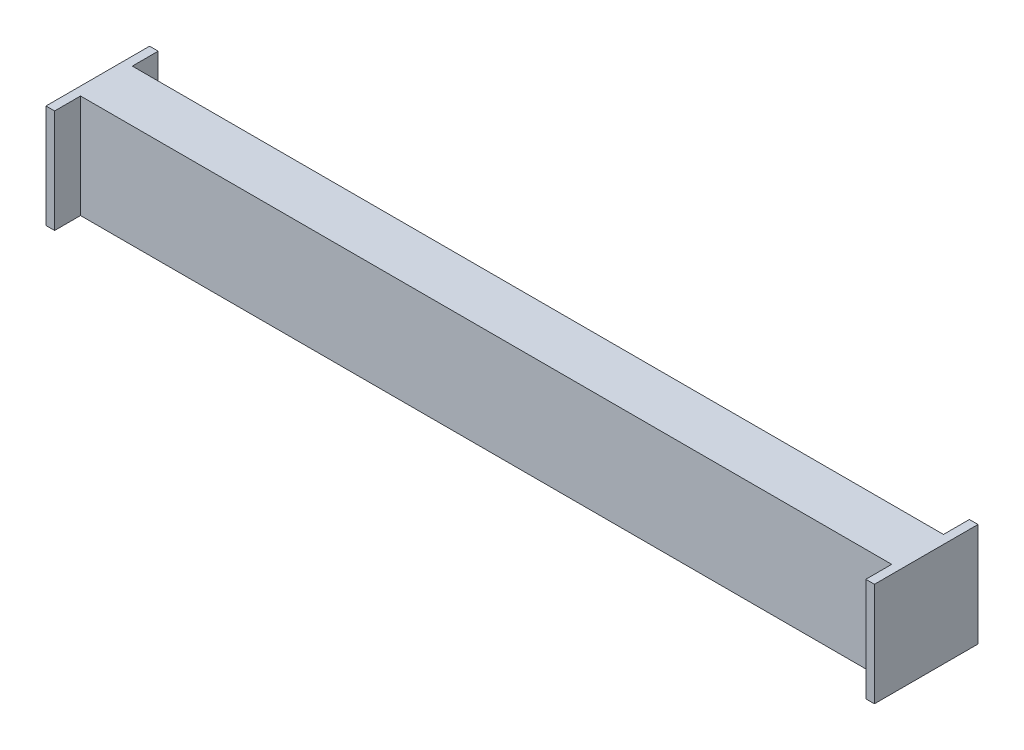
ISO-10303-21;
HEADER;
FILE_DESCRIPTION(('STEP AP214'),'2;1');
FILE_NAME('part.step','',(''),(''),'','','');
FILE_SCHEMA(('AUTOMOTIVE_DESIGN { 1 0 10303 214 1 1 1 1 }'));
ENDSEC;
DATA;
#1=APPLICATION_CONTEXT('core data for automotive mechanical design processes');
#2=APPLICATION_PROTOCOL_DEFINITION('international standard','automotive_design',2000,#1);
#3=PRODUCT_CONTEXT('',#1,'mechanical');
#4=PRODUCT('Part','Part','',(#3));
#5=PRODUCT_RELATED_PRODUCT_CATEGORY('part','',(#4));
#6=PRODUCT_DEFINITION_FORMATION('','',#4);
#7=PRODUCT_DEFINITION_CONTEXT('part definition',#1,'design');
#8=PRODUCT_DEFINITION('design','',#6,#7);
#9=PRODUCT_DEFINITION_SHAPE('','',#8);
#10=(LENGTH_UNIT() NAMED_UNIT(*) SI_UNIT(.MILLI.,.METRE.));
#11=(NAMED_UNIT(*) PLANE_ANGLE_UNIT() SI_UNIT($,.RADIAN.));
#12=(NAMED_UNIT(*) SI_UNIT($,.STERADIAN.) SOLID_ANGLE_UNIT());
#13=UNCERTAINTY_MEASURE_WITH_UNIT(LENGTH_MEASURE(1.E-05),#10,'distance_accuracy_value','');
#14=(GEOMETRIC_REPRESENTATION_CONTEXT(3) GLOBAL_UNCERTAINTY_ASSIGNED_CONTEXT((#13)) GLOBAL_UNIT_ASSIGNED_CONTEXT((#10,
#11,#12)) REPRESENTATION_CONTEXT('',''));
#15=CARTESIAN_POINT('',(0.,0.,0.));
#16=DIRECTION('',(0.,0.,1.));
#17=DIRECTION('',(1.,0.,0.));
#18=AXIS2_PLACEMENT_3D('',#15,#16,#17);
#19=CARTESIAN_POINT('',(1219.2,-76.2,-38.1));
#20=DIRECTION('',(0.,0.,1.));
#21=DIRECTION('',(1.,0.,0.));
#22=AXIS2_PLACEMENT_3D('',#19,#20,#21);
#23=PLANE('',#22);
#24=DIRECTION('',(-1.,0.,0.));
#25=VECTOR('',#24,1.);
#26=CARTESIAN_POINT('',(1219.2,-76.2,-38.1));
#27=LINE('',#26,#25);
#28=CARTESIAN_POINT('',(1206.5,-76.2,-38.1));
#29=VERTEX_POINT('',#28);
#30=CARTESIAN_POINT('',(12.7000000000004,-76.2,-38.1));
#31=VERTEX_POINT('',#30);
#32=EDGE_CURVE('E207',#29,#31,#27,.T.);
#33=ORIENTED_EDGE('',*,*,#32,.T.);
#34=DIRECTION('',(0.,1.,0.));
#35=VECTOR('',#34,1.);
#36=CARTESIAN_POINT('',(12.6999999999999,-76.2,-38.1));
#37=LINE('',#36,#35);
#38=CARTESIAN_POINT('',(12.7000000000004,76.2,-38.1));
#39=VERTEX_POINT('',#38);
#40=EDGE_CURVE('E46',#31,#39,#37,.T.);
#41=ORIENTED_EDGE('',*,*,#40,.T.);
#42=DIRECTION('',(-1.,0.,0.));
#43=VECTOR('',#42,1.);
#44=CARTESIAN_POINT('',(1219.2,76.2,-38.1));
#45=LINE('',#44,#43);
#46=CARTESIAN_POINT('',(1206.5,76.2,-38.1));
#47=VERTEX_POINT('',#46);
#48=EDGE_CURVE('E11',#47,#39,#45,.T.);
#49=ORIENTED_EDGE('',*,*,#48,.F.);
#50=DIRECTION('',(0.,-1.,0.));
#51=VECTOR('',#50,1.);
#52=CARTESIAN_POINT('',(1206.5,-76.2,-38.1));
#53=LINE('',#52,#51);
#54=EDGE_CURVE('E199',#47,#29,#53,.T.);
#55=ORIENTED_EDGE('',*,*,#54,.T.);
#56=EDGE_LOOP('',(#33,#41,#49,#55));
#57=FACE_BOUND('',#56,.T.);
#58=ADVANCED_FACE('F32',(#57),#23,.F.);
#59=CARTESIAN_POINT('',(1219.2,76.2,38.1));
#60=DIRECTION('',(0.,-1.,0.));
#61=DIRECTION('',(0.,0.,-1.));
#62=AXIS2_PLACEMENT_3D('',#59,#60,#61);
#63=PLANE('',#62);
#64=ORIENTED_EDGE('',*,*,#48,.T.);
#65=DIRECTION('',(0.,0.,-1.));
#66=VECTOR('',#65,1.);
#67=CARTESIAN_POINT('',(12.7,76.2,-76.2));
#68=LINE('',#67,#66);
#69=CARTESIAN_POINT('',(12.7,76.2,-76.2));
#70=VERTEX_POINT('',#69);
#71=EDGE_CURVE('E140',#39,#70,#68,.T.);
#72=ORIENTED_EDGE('',*,*,#71,.T.);
#73=DIRECTION('',(-1.,0.,0.));
#74=VECTOR('',#73,1.);
#75=CARTESIAN_POINT('',(12.7,76.2,-76.2));
#76=LINE('',#75,#74);
#77=CARTESIAN_POINT('',(0.,76.2,-76.2));
#78=VERTEX_POINT('',#77);
#79=EDGE_CURVE('E130',#70,#78,#76,.T.);
#80=ORIENTED_EDGE('',*,*,#79,.T.);
#81=DIRECTION('',(0.,0.,1.));
#82=VECTOR('',#81,1.);
#83=CARTESIAN_POINT('',(0.,76.2,38.1));
#84=LINE('',#83,#82);
#85=CARTESIAN_POINT('',(0.,76.2,76.2));
#86=VERTEX_POINT('',#85);
#87=EDGE_CURVE('E125',#78,#86,#84,.T.);
#88=ORIENTED_EDGE('',*,*,#87,.T.);
#89=DIRECTION('',(-1.,0.,0.));
#90=VECTOR('',#89,1.);
#91=CARTESIAN_POINT('',(12.7,76.2,76.2));
#92=LINE('',#91,#90);
#93=CARTESIAN_POINT('',(12.7,76.2,76.2));
#94=VERTEX_POINT('',#93);
#95=EDGE_CURVE('E120',#94,#86,#92,.T.);
#96=ORIENTED_EDGE('',*,*,#95,.F.);
#97=CARTESIAN_POINT('',(12.7000000000004,76.2,38.1));
#98=VERTEX_POINT('',#97);
#99=EDGE_CURVE('E123',#94,#98,#68,.T.);
#100=ORIENTED_EDGE('',*,*,#99,.T.);
#101=DIRECTION('',(-1.,0.,0.));
#102=VECTOR('',#101,1.);
#103=CARTESIAN_POINT('',(1219.2,76.2,38.1));
#104=LINE('',#103,#102);
#105=CARTESIAN_POINT('',(1206.5,76.2,38.1));
#106=VERTEX_POINT('',#105);
#107=EDGE_CURVE('E39',#106,#98,#104,.T.);
#108=ORIENTED_EDGE('',*,*,#107,.F.);
#109=DIRECTION('',(0.,0.,1.));
#110=VECTOR('',#109,1.);
#111=CARTESIAN_POINT('',(1206.5,76.2,76.2));
#112=LINE('',#111,#110);
#113=CARTESIAN_POINT('',(1206.5,76.2,76.2));
#114=VERTEX_POINT('',#113);
#115=EDGE_CURVE('E169',#106,#114,#112,.T.);
#116=ORIENTED_EDGE('',*,*,#115,.T.);
#117=DIRECTION('',(1.,0.,0.));
#118=VECTOR('',#117,1.);
#119=CARTESIAN_POINT('',(1206.5,76.2,76.2));
#120=LINE('',#119,#118);
#121=CARTESIAN_POINT('',(1219.2,76.2,76.2));
#122=VERTEX_POINT('',#121);
#123=EDGE_CURVE('E193',#114,#122,#120,.T.);
#124=ORIENTED_EDGE('',*,*,#123,.T.);
#125=DIRECTION('',(0.,0.,1.));
#126=VECTOR('',#125,1.);
#127=CARTESIAN_POINT('',(1219.2,76.2,38.1));
#128=LINE('',#127,#126);
#129=CARTESIAN_POINT('',(1219.2,76.2,-76.2));
#130=VERTEX_POINT('',#129);
#131=EDGE_CURVE('E202',#130,#122,#128,.T.);
#132=ORIENTED_EDGE('',*,*,#131,.F.);
#133=DIRECTION('',(1.,0.,0.));
#134=VECTOR('',#133,1.);
#135=CARTESIAN_POINT('',(1206.5,76.2,-76.2));
#136=LINE('',#135,#134);
#137=CARTESIAN_POINT('',(1206.5,76.2,-76.2));
#138=VERTEX_POINT('',#137);
#139=EDGE_CURVE('E181',#138,#130,#136,.T.);
#140=ORIENTED_EDGE('',*,*,#139,.F.);
#141=EDGE_CURVE('E171',#138,#47,#112,.T.);
#142=ORIENTED_EDGE('',*,*,#141,.T.);
#143=EDGE_LOOP('',(#64,#72,#80,#88,#96,#100,#108,#116,#124,#132,#140,#142));
#144=FACE_BOUND('',#143,.T.);
#145=ADVANCED_FACE('F122',(#144),#63,.F.);
#146=CARTESIAN_POINT('',(1219.2,-76.2,38.1));
#147=DIRECTION('',(0.,0.,-1.));
#148=DIRECTION('',(-1.,0.,0.));
#149=AXIS2_PLACEMENT_3D('',#146,#147,#148);
#150=PLANE('',#149);
#151=ORIENTED_EDGE('',*,*,#107,.T.);
#152=DIRECTION('',(0.,-1.,0.));
#153=VECTOR('',#152,1.);
#154=CARTESIAN_POINT('',(12.6999999999999,-76.2,38.1));
#155=LINE('',#154,#153);
#156=CARTESIAN_POINT('',(12.7000000000004,-76.2,38.1));
#157=VERTEX_POINT('',#156);
#158=EDGE_CURVE('E138',#98,#157,#155,.T.);
#159=ORIENTED_EDGE('',*,*,#158,.T.);
#160=DIRECTION('',(-1.,0.,0.));
#161=VECTOR('',#160,1.);
#162=CARTESIAN_POINT('',(1219.2,-76.2,38.1));
#163=LINE('',#162,#161);
#164=CARTESIAN_POINT('',(1206.5,-76.2,38.1));
#165=VERTEX_POINT('',#164);
#166=EDGE_CURVE('E211',#165,#157,#163,.T.);
#167=ORIENTED_EDGE('',*,*,#166,.F.);
#168=DIRECTION('',(0.,1.,0.));
#169=VECTOR('',#168,1.);
#170=CARTESIAN_POINT('',(1206.5,-76.2,38.1));
#171=LINE('',#170,#169);
#172=EDGE_CURVE('E189',#165,#106,#171,.T.);
#173=ORIENTED_EDGE('',*,*,#172,.T.);
#174=EDGE_LOOP('',(#151,#159,#167,#173));
#175=FACE_BOUND('',#174,.T.);
#176=ADVANCED_FACE('F217',(#175),#150,.F.);
#177=CARTESIAN_POINT('',(1219.2,-76.2,38.1));
#178=DIRECTION('',(0.,1.,0.));
#179=DIRECTION('',(0.,0.,1.));
#180=AXIS2_PLACEMENT_3D('',#177,#178,#179);
#181=PLANE('',#180);
#182=ORIENTED_EDGE('',*,*,#166,.T.);
#183=DIRECTION('',(0.,0.,1.));
#184=VECTOR('',#183,1.);
#185=CARTESIAN_POINT('',(12.7,-76.2,-76.2));
#186=LINE('',#185,#184);
#187=CARTESIAN_POINT('',(12.7,-76.2,76.2));
#188=VERTEX_POINT('',#187);
#189=EDGE_CURVE('E154',#157,#188,#186,.T.);
#190=ORIENTED_EDGE('',*,*,#189,.T.);
#191=DIRECTION('',(-1.,0.,0.));
#192=VECTOR('',#191,1.);
#193=CARTESIAN_POINT('',(12.7,-76.2,76.2));
#194=LINE('',#193,#192);
#195=CARTESIAN_POINT('',(0.,-76.2,76.2));
#196=VERTEX_POINT('',#195);
#197=EDGE_CURVE('E145',#188,#196,#194,.T.);
#198=ORIENTED_EDGE('',*,*,#197,.T.);
#199=DIRECTION('',(0.,0.,-1.));
#200=VECTOR('',#199,1.);
#201=CARTESIAN_POINT('',(0.,-76.2,38.1));
#202=LINE('',#201,#200);
#203=CARTESIAN_POINT('',(0.,-76.2,-76.2));
#204=VERTEX_POINT('',#203);
#205=EDGE_CURVE('E205',#196,#204,#202,.T.);
#206=ORIENTED_EDGE('',*,*,#205,.T.);
#207=DIRECTION('',(-1.,0.,0.));
#208=VECTOR('',#207,1.);
#209=CARTESIAN_POINT('',(12.7,-76.2,-76.2));
#210=LINE('',#209,#208);
#211=CARTESIAN_POINT('',(12.7,-76.2,-76.2));
#212=VERTEX_POINT('',#211);
#213=EDGE_CURVE('E159',#212,#204,#210,.T.);
#214=ORIENTED_EDGE('',*,*,#213,.F.);
#215=EDGE_CURVE('E131',#212,#31,#186,.T.);
#216=ORIENTED_EDGE('',*,*,#215,.T.);
#217=ORIENTED_EDGE('',*,*,#32,.F.);
#218=DIRECTION('',(0.,0.,-1.));
#219=VECTOR('',#218,1.);
#220=CARTESIAN_POINT('',(1206.5,-76.2,76.2));
#221=LINE('',#220,#219);
#222=CARTESIAN_POINT('',(1206.5,-76.2,-76.2));
#223=VERTEX_POINT('',#222);
#224=EDGE_CURVE('E177',#29,#223,#221,.T.);
#225=ORIENTED_EDGE('',*,*,#224,.T.);
#226=DIRECTION('',(1.,0.,0.));
#227=VECTOR('',#226,1.);
#228=CARTESIAN_POINT('',(1206.5,-76.2,-76.2));
#229=LINE('',#228,#227);
#230=CARTESIAN_POINT('',(1219.2,-76.2,-76.2));
#231=VERTEX_POINT('',#230);
#232=EDGE_CURVE('E186',#223,#231,#229,.T.);
#233=ORIENTED_EDGE('',*,*,#232,.T.);
#234=DIRECTION('',(0.,0.,-1.));
#235=VECTOR('',#234,1.);
#236=CARTESIAN_POINT('',(1219.2,-76.2,38.1));
#237=LINE('',#236,#235);
#238=CARTESIAN_POINT('',(1219.2,-76.2,76.2));
#239=VERTEX_POINT('',#238);
#240=EDGE_CURVE('E204',#239,#231,#237,.T.);
#241=ORIENTED_EDGE('',*,*,#240,.F.);
#242=DIRECTION('',(1.,0.,0.));
#243=VECTOR('',#242,1.);
#244=CARTESIAN_POINT('',(1206.5,-76.2,76.2));
#245=LINE('',#244,#243);
#246=CARTESIAN_POINT('',(1206.5,-76.2,76.2));
#247=VERTEX_POINT('',#246);
#248=EDGE_CURVE('E190',#247,#239,#245,.T.);
#249=ORIENTED_EDGE('',*,*,#248,.F.);
#250=EDGE_CURVE('E178',#247,#165,#221,.T.);
#251=ORIENTED_EDGE('',*,*,#250,.T.);
#252=EDGE_LOOP('',(#182,#190,#198,#206,#214,#216,#217,#225,#233,#241,#249,#251));
#253=FACE_BOUND('',#252,.T.);
#254=ADVANCED_FACE('F215',(#253),#181,.F.);
#255=CARTESIAN_POINT('',(1219.2,0.,0.));
#256=DIRECTION('',(-1.,0.,0.));
#257=DIRECTION('',(0.,0.,1.));
#258=AXIS2_PLACEMENT_3D('',#255,#256,#257);
#259=PLANE('',#258);
#260=ORIENTED_EDGE('',*,*,#240,.T.);
#261=DIRECTION('',(0.,1.,0.));
#262=VECTOR('',#261,1.);
#263=CARTESIAN_POINT('',(1219.2,-76.2,-76.2));
#264=LINE('',#263,#262);
#265=EDGE_CURVE('E165',#231,#130,#264,.T.);
#266=ORIENTED_EDGE('',*,*,#265,.T.);
#267=ORIENTED_EDGE('',*,*,#131,.T.);
#268=DIRECTION('',(0.,-1.,0.));
#269=VECTOR('',#268,1.);
#270=CARTESIAN_POINT('',(1219.2,-76.2,76.2));
#271=LINE('',#270,#269);
#272=EDGE_CURVE('E170',#122,#239,#271,.T.);
#273=ORIENTED_EDGE('',*,*,#272,.T.);
#274=EDGE_LOOP('',(#260,#266,#267,#273));
#275=FACE_BOUND('',#274,.T.);
#276=ADVANCED_FACE('F257',(#275),#259,.F.);
#277=CARTESIAN_POINT('',(0.,0.,0.));
#278=DIRECTION('',(-1.,0.,0.));
#279=DIRECTION('',(0.,0.,1.));
#280=AXIS2_PLACEMENT_3D('',#277,#278,#279);
#281=PLANE('',#280);
#282=ORIENTED_EDGE('',*,*,#87,.F.);
#283=DIRECTION('',(0.,-1.,0.));
#284=VECTOR('',#283,1.);
#285=CARTESIAN_POINT('',(0.,-76.2,-76.2));
#286=LINE('',#285,#284);
#287=EDGE_CURVE('E146',#78,#204,#286,.T.);
#288=ORIENTED_EDGE('',*,*,#287,.T.);
#289=ORIENTED_EDGE('',*,*,#205,.F.);
#290=DIRECTION('',(0.,1.,0.));
#291=VECTOR('',#290,1.);
#292=CARTESIAN_POINT('',(0.,-76.2,76.2));
#293=LINE('',#292,#291);
#294=EDGE_CURVE('E149',#196,#86,#293,.T.);
#295=ORIENTED_EDGE('',*,*,#294,.T.);
#296=EDGE_LOOP('',(#282,#288,#289,#295));
#297=FACE_BOUND('',#296,.T.);
#298=ADVANCED_FACE('F234',(#297),#281,.T.);
#299=CARTESIAN_POINT('',(1206.5,-76.2,76.2));
#300=DIRECTION('',(0.,0.,1.));
#301=DIRECTION('',(1.,0.,0.));
#302=AXIS2_PLACEMENT_3D('',#299,#300,#301);
#303=PLANE('',#302);
#304=ORIENTED_EDGE('',*,*,#272,.F.);
#305=ORIENTED_EDGE('',*,*,#123,.F.);
#306=DIRECTION('',(0.,-1.,0.));
#307=VECTOR('',#306,1.);
#308=CARTESIAN_POINT('',(1206.5,-76.2,76.2));
#309=LINE('',#308,#307);
#310=EDGE_CURVE('E174',#114,#247,#309,.T.);
#311=ORIENTED_EDGE('',*,*,#310,.T.);
#312=ORIENTED_EDGE('',*,*,#248,.T.);
#313=EDGE_LOOP('',(#304,#305,#311,#312));
#314=FACE_BOUND('',#313,.T.);
#315=ADVANCED_FACE('F223',(#314),#303,.T.);
#316=CARTESIAN_POINT('',(1206.5,0.,0.));
#317=DIRECTION('',(-1.,0.,0.));
#318=DIRECTION('',(0.,0.,1.));
#319=AXIS2_PLACEMENT_3D('',#316,#317,#318);
#320=PLANE('',#319);
#321=ORIENTED_EDGE('',*,*,#172,.F.);
#322=ORIENTED_EDGE('',*,*,#250,.F.);
#323=ORIENTED_EDGE('',*,*,#310,.F.);
#324=ORIENTED_EDGE('',*,*,#115,.F.);
#325=EDGE_LOOP('',(#321,#322,#323,#324));
#326=FACE_BOUND('',#325,.T.);
#327=ADVANCED_FACE('F224',(#326),#320,.T.);
#328=ORIENTED_EDGE('',*,*,#54,.F.);
#329=ORIENTED_EDGE('',*,*,#141,.F.);
#330=DIRECTION('',(0.,1.,0.));
#331=VECTOR('',#330,1.);
#332=CARTESIAN_POINT('',(1206.5,-76.2,-76.2));
#333=LINE('',#332,#331);
#334=EDGE_CURVE('E166',#223,#138,#333,.T.);
#335=ORIENTED_EDGE('',*,*,#334,.F.);
#336=ORIENTED_EDGE('',*,*,#224,.F.);
#337=EDGE_LOOP('',(#328,#329,#335,#336));
#338=FACE_BOUND('',#337,.T.);
#339=ADVANCED_FACE('F226',(#338),#320,.T.);
#340=CARTESIAN_POINT('',(1206.5,-76.2,-76.2));
#341=DIRECTION('',(0.,0.,-1.));
#342=DIRECTION('',(-1.,0.,0.));
#343=AXIS2_PLACEMENT_3D('',#340,#341,#342);
#344=PLANE('',#343);
#345=ORIENTED_EDGE('',*,*,#265,.F.);
#346=ORIENTED_EDGE('',*,*,#232,.F.);
#347=ORIENTED_EDGE('',*,*,#334,.T.);
#348=ORIENTED_EDGE('',*,*,#139,.T.);
#349=EDGE_LOOP('',(#345,#346,#347,#348));
#350=FACE_BOUND('',#349,.T.);
#351=ADVANCED_FACE('F232',(#350),#344,.T.);
#352=CARTESIAN_POINT('',(12.7,-76.2,76.2));
#353=DIRECTION('',(0.,0.,1.));
#354=DIRECTION('',(1.,0.,0.));
#355=AXIS2_PLACEMENT_3D('',#352,#353,#354);
#356=PLANE('',#355);
#357=ORIENTED_EDGE('',*,*,#294,.F.);
#358=ORIENTED_EDGE('',*,*,#197,.F.);
#359=DIRECTION('',(0.,1.,0.));
#360=VECTOR('',#359,1.);
#361=CARTESIAN_POINT('',(12.7,-76.2,76.2));
#362=LINE('',#361,#360);
#363=EDGE_CURVE('E137',#188,#94,#362,.T.);
#364=ORIENTED_EDGE('',*,*,#363,.T.);
#365=ORIENTED_EDGE('',*,*,#95,.T.);
#366=EDGE_LOOP('',(#357,#358,#364,#365));
#367=FACE_BOUND('',#366,.T.);
#368=ADVANCED_FACE('F143',(#367),#356,.T.);
#369=CARTESIAN_POINT('',(12.7,0.,0.));
#370=DIRECTION('',(1.,0.,0.));
#371=DIRECTION('',(0.,0.,-1.));
#372=AXIS2_PLACEMENT_3D('',#369,#370,#371);
#373=PLANE('',#372);
#374=ORIENTED_EDGE('',*,*,#158,.F.);
#375=ORIENTED_EDGE('',*,*,#99,.F.);
#376=ORIENTED_EDGE('',*,*,#363,.F.);
#377=ORIENTED_EDGE('',*,*,#189,.F.);
#378=EDGE_LOOP('',(#374,#375,#376,#377));
#379=FACE_BOUND('',#378,.T.);
#380=ADVANCED_FACE('F135',(#379),#373,.T.);
#381=ORIENTED_EDGE('',*,*,#40,.F.);
#382=ORIENTED_EDGE('',*,*,#215,.F.);
#383=DIRECTION('',(0.,-1.,0.));
#384=VECTOR('',#383,1.);
#385=CARTESIAN_POINT('',(12.7,-76.2,-76.2));
#386=LINE('',#385,#384);
#387=EDGE_CURVE('E139',#70,#212,#386,.T.);
#388=ORIENTED_EDGE('',*,*,#387,.F.);
#389=ORIENTED_EDGE('',*,*,#71,.F.);
#390=EDGE_LOOP('',(#381,#382,#388,#389));
#391=FACE_BOUND('',#390,.T.);
#392=ADVANCED_FACE('F245',(#391),#373,.T.);
#393=CARTESIAN_POINT('',(12.7,-76.2,-76.2));
#394=DIRECTION('',(0.,0.,-1.));
#395=DIRECTION('',(-1.,0.,0.));
#396=AXIS2_PLACEMENT_3D('',#393,#394,#395);
#397=PLANE('',#396);
#398=ORIENTED_EDGE('',*,*,#287,.F.);
#399=ORIENTED_EDGE('',*,*,#79,.F.);
#400=ORIENTED_EDGE('',*,*,#387,.T.);
#401=ORIENTED_EDGE('',*,*,#213,.T.);
#402=EDGE_LOOP('',(#398,#399,#400,#401));
#403=FACE_BOUND('',#402,.T.);
#404=ADVANCED_FACE('F250',(#403),#397,.T.);
#405=CLOSED_SHELL('',(#58,#145,#176,#254,#276,#298,#315,#327,#339,#351,#368,#380,#392,#404));
#406=MANIFOLD_SOLID_BREP('B2',#405);
#407=ADVANCED_BREP_SHAPE_REPRESENTATION('',(#18,#406),#14);
#408=SHAPE_DEFINITION_REPRESENTATION(#9,#407);
ENDSEC;
END-ISO-10303-21;
